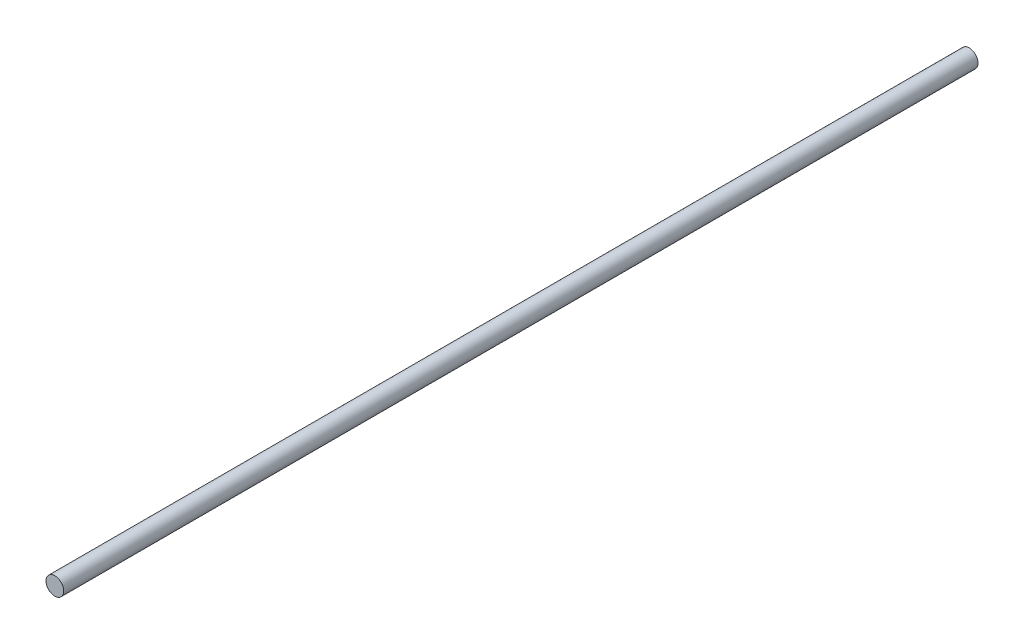
ISO-10303-21;
HEADER;
FILE_DESCRIPTION(('STEP AP214'),'2;1');
FILE_NAME('part.step','',(''),(''),'','','');
FILE_SCHEMA(('AUTOMOTIVE_DESIGN { 1 0 10303 214 1 1 1 1 }'));
ENDSEC;
DATA;
#1=APPLICATION_CONTEXT('core data for automotive mechanical design processes');
#2=APPLICATION_PROTOCOL_DEFINITION('international standard','automotive_design',2000,#1);
#3=PRODUCT_CONTEXT('',#1,'mechanical');
#4=PRODUCT('Part','Part','',(#3));
#5=PRODUCT_RELATED_PRODUCT_CATEGORY('part','',(#4));
#6=PRODUCT_DEFINITION_FORMATION('','',#4);
#7=PRODUCT_DEFINITION_CONTEXT('part definition',#1,'design');
#8=PRODUCT_DEFINITION('design','',#6,#7);
#9=PRODUCT_DEFINITION_SHAPE('','',#8);
#10=(LENGTH_UNIT() NAMED_UNIT(*) SI_UNIT(.MILLI.,.METRE.));
#11=(NAMED_UNIT(*) PLANE_ANGLE_UNIT() SI_UNIT($,.RADIAN.));
#12=(NAMED_UNIT(*) SI_UNIT($,.STERADIAN.) SOLID_ANGLE_UNIT());
#13=UNCERTAINTY_MEASURE_WITH_UNIT(LENGTH_MEASURE(1.E-05),#10,'distance_accuracy_value','');
#14=(GEOMETRIC_REPRESENTATION_CONTEXT(3) GLOBAL_UNCERTAINTY_ASSIGNED_CONTEXT((#13)) GLOBAL_UNIT_ASSIGNED_CONTEXT((#10,
#11,#12)) REPRESENTATION_CONTEXT('',''));
#15=CARTESIAN_POINT('',(0.,0.,0.));
#16=DIRECTION('',(0.,0.,1.));
#17=DIRECTION('',(1.,0.,0.));
#18=AXIS2_PLACEMENT_3D('',#15,#16,#17);
#19=CARTESIAN_POINT('',(0.,0.,207.));
#20=DIRECTION('',(0.,0.,-1.));
#21=DIRECTION('',(-1.,0.,0.));
#22=AXIS2_PLACEMENT_3D('',#19,#20,#21);
#23=CYLINDRICAL_SURFACE('',#22,2.);
#24=CARTESIAN_POINT('',(0.,0.,207.));
#25=DIRECTION('',(0.,0.,1.));
#26=DIRECTION('',(1.,0.,0.));
#27=AXIS2_PLACEMENT_3D('',#24,#25,#26);
#28=CIRCLE('',#27,2.);
#29=CARTESIAN_POINT('',(-2.,0.,207.));
#30=VERTEX_POINT('',#29);
#31=EDGE_CURVE('E10',#30,#30,#28,.T.);
#32=CARTESIAN_POINT('',(0.,0.,0.));
#33=DIRECTION('',(0.,0.,1.));
#34=DIRECTION('',(1.,0.,0.));
#35=AXIS2_PLACEMENT_3D('',#32,#33,#34);
#36=CIRCLE('',#35,2.);
#37=CARTESIAN_POINT('',(-2.,0.,0.));
#38=VERTEX_POINT('',#37);
#39=EDGE_CURVE('E34',#38,#38,#36,.T.);
#40=CARTESIAN_POINT('',(-2.,0.,207.));
#41=CARTESIAN_POINT('',(-2.,0.,204.84375));
#42=CARTESIAN_POINT('',(-2.,0.,202.6875));
#43=CARTESIAN_POINT('',(-2.,0.,198.375));
#44=CARTESIAN_POINT('',(-2.,0.,196.21875));
#45=CARTESIAN_POINT('',(-2.,0.,191.90625));
#46=CARTESIAN_POINT('',(-2.,0.,189.75));
#47=CARTESIAN_POINT('',(-2.,0.,185.4375));
#48=CARTESIAN_POINT('',(-2.,0.,183.28125));
#49=CARTESIAN_POINT('',(-2.,0.,178.96875));
#50=CARTESIAN_POINT('',(-2.,0.,176.8125));
#51=CARTESIAN_POINT('',(-2.,0.,172.5));
#52=CARTESIAN_POINT('',(-2.,0.,170.34375));
#53=CARTESIAN_POINT('',(-2.,0.,166.03125));
#54=CARTESIAN_POINT('',(-2.,0.,163.875));
#55=CARTESIAN_POINT('',(-2.,0.,159.5625));
#56=CARTESIAN_POINT('',(-2.,0.,157.40625));
#57=CARTESIAN_POINT('',(-2.,0.,153.09375));
#58=CARTESIAN_POINT('',(-2.,0.,150.9375));
#59=CARTESIAN_POINT('',(-2.,0.,146.625));
#60=CARTESIAN_POINT('',(-2.,0.,144.46875));
#61=CARTESIAN_POINT('',(-2.,0.,140.15625));
#62=CARTESIAN_POINT('',(-2.,0.,138.));
#63=CARTESIAN_POINT('',(-2.,0.,133.6875));
#64=CARTESIAN_POINT('',(-2.,0.,131.53125));
#65=CARTESIAN_POINT('',(-2.,0.,127.21875));
#66=CARTESIAN_POINT('',(-2.,0.,125.0625));
#67=CARTESIAN_POINT('',(-2.,0.,120.75));
#68=CARTESIAN_POINT('',(-2.,0.,118.59375));
#69=CARTESIAN_POINT('',(-2.,0.,114.28125));
#70=CARTESIAN_POINT('',(-2.,0.,112.125));
#71=CARTESIAN_POINT('',(-2.,0.,107.8125));
#72=CARTESIAN_POINT('',(-2.,0.,105.65625));
#73=CARTESIAN_POINT('',(-2.,0.,101.34375));
#74=CARTESIAN_POINT('',(-2.,0.,99.1875));
#75=CARTESIAN_POINT('',(-2.,0.,94.875));
#76=CARTESIAN_POINT('',(-2.,0.,92.71875));
#77=CARTESIAN_POINT('',(-2.,0.,88.40625));
#78=CARTESIAN_POINT('',(-2.,0.,86.25));
#79=CARTESIAN_POINT('',(-2.,0.,81.9375));
#80=CARTESIAN_POINT('',(-2.,0.,79.78125));
#81=CARTESIAN_POINT('',(-2.,0.,75.46875));
#82=CARTESIAN_POINT('',(-2.,0.,73.3125));
#83=CARTESIAN_POINT('',(-2.,0.,69.));
#84=CARTESIAN_POINT('',(-2.,0.,66.84375));
#85=CARTESIAN_POINT('',(-2.,0.,62.53125));
#86=CARTESIAN_POINT('',(-2.,0.,60.375));
#87=CARTESIAN_POINT('',(-2.,0.,56.0625));
#88=CARTESIAN_POINT('',(-2.,0.,53.90625));
#89=CARTESIAN_POINT('',(-2.,0.,49.59375));
#90=CARTESIAN_POINT('',(-2.,0.,47.4375));
#91=CARTESIAN_POINT('',(-2.,0.,43.125));
#92=CARTESIAN_POINT('',(-2.,0.,40.96875));
#93=CARTESIAN_POINT('',(-2.,0.,36.65625));
#94=CARTESIAN_POINT('',(-2.,0.,34.5));
#95=CARTESIAN_POINT('',(-2.,0.,30.1875));
#96=CARTESIAN_POINT('',(-2.,0.,28.03125));
#97=CARTESIAN_POINT('',(-2.,0.,23.71875));
#98=CARTESIAN_POINT('',(-2.,0.,21.5625));
#99=CARTESIAN_POINT('',(-2.,0.,17.25));
#100=CARTESIAN_POINT('',(-2.,0.,15.09375));
#101=CARTESIAN_POINT('',(-2.,0.,10.78125));
#102=CARTESIAN_POINT('',(-2.,0.,8.62499999999997));
#103=CARTESIAN_POINT('',(-2.,0.,4.31249999999997));
#104=CARTESIAN_POINT('',(-2.,0.,2.15624999999997));
#105=CARTESIAN_POINT('',(-2.,0.,0.));
#106=B_SPLINE_CURVE_WITH_KNOTS('',3,(#40,#41,#42,#43,#44,#45,#46,#47,#48,#49,#50,#51,#52,#53,
#54,#55,#56,#57,#58,#59,#60,#61,#62,#63,#64,#65,#66,#67,#68,#69,#70,#71,#72,#73,#74,#75,#76,#77,
#78,#79,#80,#81,#82,#83,#84,#85,#86,#87,#88,#89,#90,#91,#92,#93,#94,#95,#96,#97,#98,#99,#100,
#101,#102,#103,#104,#105),.UNSPECIFIED.,.F.,.F.,(4,2,2,2,2,2,2,2,2,2,2,2,2,2,2,2,2,2,2,2,2,2,2,
2,2,2,2,2,2,2,2,2,4),(0.,6.46875000000002,12.9375,19.40625,25.875,32.34375,38.8125,45.28125,
51.75,58.21875,64.6875,71.15625,77.625,84.09375,90.5625,97.03125,103.5,109.96875,116.4375,
122.90625,129.375,135.84375,142.3125,148.78125,155.25,161.71875,168.1875,174.65625,181.125,
187.59375,194.0625,200.53125,207.),.UNSPECIFIED.);
#107=EDGE_CURVE('BSEAM31',#30,#38,#106,.T.);
#108=ORIENTED_EDGE('',*,*,#31,.F.);
#109=ORIENTED_EDGE('',*,*,#39,.T.);
#110=ORIENTED_EDGE('',*,*,#107,.T.);
#111=ORIENTED_EDGE('',*,*,#107,.F.);
#112=EDGE_LOOP('',(#108,#110,#109,#111));
#113=FACE_BOUND('',#112,.T.);
#114=ADVANCED_FACE('F31',(#113),#23,.T.);
#115=CARTESIAN_POINT('',(0.,0.,207.));
#116=DIRECTION('',(0.,0.,1.));
#117=DIRECTION('',(1.,0.,0.));
#118=AXIS2_PLACEMENT_3D('',#115,#116,#117);
#119=PLANE('',#118);
#120=ORIENTED_EDGE('',*,*,#31,.T.);
#121=EDGE_LOOP('',(#120));
#122=FACE_BOUND('',#121,.T.);
#123=ADVANCED_FACE('F46',(#122),#119,.T.);
#124=CARTESIAN_POINT('',(0.,0.,0.));
#125=DIRECTION('',(0.,0.,1.));
#126=DIRECTION('',(1.,0.,0.));
#127=AXIS2_PLACEMENT_3D('',#124,#125,#126);
#128=PLANE('',#127);
#129=ORIENTED_EDGE('',*,*,#39,.F.);
#130=EDGE_LOOP('',(#129));
#131=FACE_BOUND('',#130,.T.);
#132=ADVANCED_FACE('F44',(#131),#128,.F.);
#133=CLOSED_SHELL('',(#114,#123,#132));
#134=MANIFOLD_SOLID_BREP('B2',#133);
#135=ADVANCED_BREP_SHAPE_REPRESENTATION('',(#18,#134),#14);
#136=SHAPE_DEFINITION_REPRESENTATION(#9,#135);
ENDSEC;
END-ISO-10303-21;
